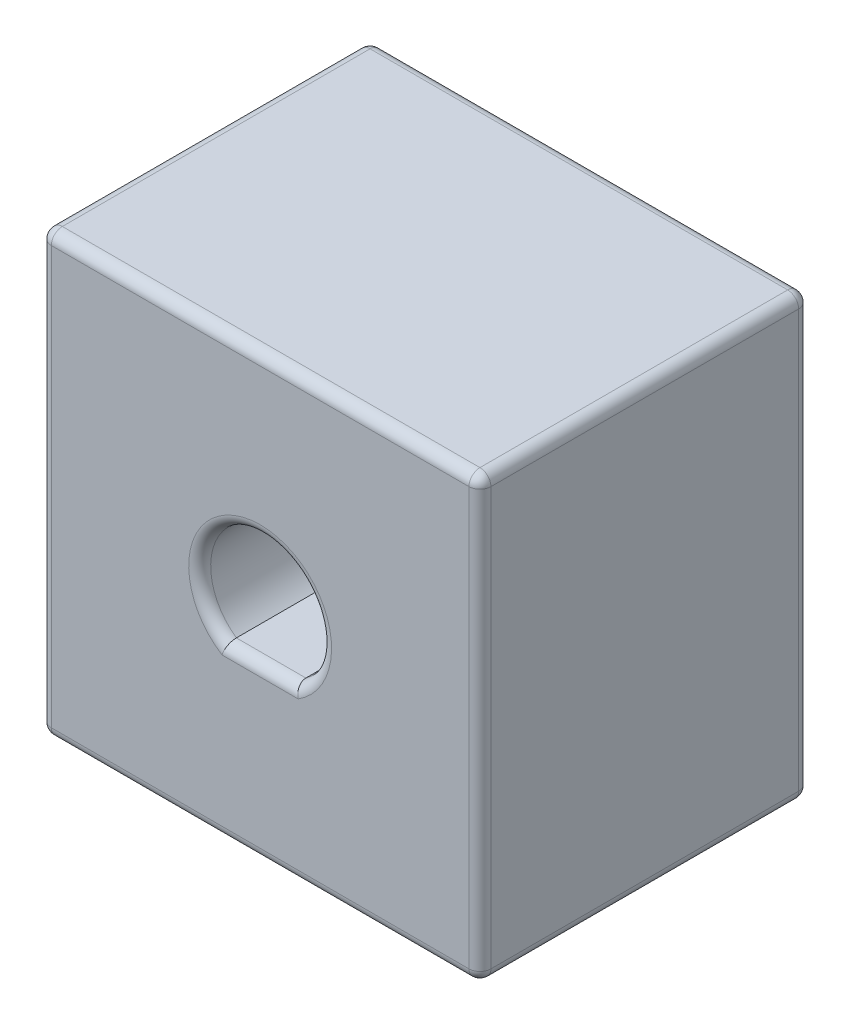
ISO-10303-21;
HEADER;
FILE_DESCRIPTION(('STEP AP214'),'2;1');
FILE_NAME('part.step','',(''),(''),'','','');
FILE_SCHEMA(('AUTOMOTIVE_DESIGN { 1 0 10303 214 1 1 1 1 }'));
ENDSEC;
DATA;
#1=APPLICATION_CONTEXT('core data for automotive mechanical design processes');
#2=APPLICATION_PROTOCOL_DEFINITION('international standard','automotive_design',2000,#1);
#3=PRODUCT_CONTEXT('',#1,'mechanical');
#4=PRODUCT('Part','Part','',(#3));
#5=PRODUCT_RELATED_PRODUCT_CATEGORY('part','',(#4));
#6=PRODUCT_DEFINITION_FORMATION('','',#4);
#7=PRODUCT_DEFINITION_CONTEXT('part definition',#1,'design');
#8=PRODUCT_DEFINITION('design','',#6,#7);
#9=PRODUCT_DEFINITION_SHAPE('','',#8);
#10=(LENGTH_UNIT() NAMED_UNIT(*) SI_UNIT(.MILLI.,.METRE.));
#11=(NAMED_UNIT(*) PLANE_ANGLE_UNIT() SI_UNIT($,.RADIAN.));
#12=(NAMED_UNIT(*) SI_UNIT($,.STERADIAN.) SOLID_ANGLE_UNIT());
#13=UNCERTAINTY_MEASURE_WITH_UNIT(LENGTH_MEASURE(1.E-05),#10,'distance_accuracy_value','');
#14=(GEOMETRIC_REPRESENTATION_CONTEXT(3) GLOBAL_UNCERTAINTY_ASSIGNED_CONTEXT((#13)) GLOBAL_UNIT_ASSIGNED_CONTEXT((#10,
#11,#12)) REPRESENTATION_CONTEXT('',''));
#15=CARTESIAN_POINT('',(0.,0.,0.));
#16=DIRECTION('',(0.,0.,1.));
#17=DIRECTION('',(1.,0.,0.));
#18=AXIS2_PLACEMENT_3D('',#15,#16,#17);
#19=CARTESIAN_POINT('',(0.,-10.,15.));
#20=DIRECTION('',(0.,1.,0.));
#21=DIRECTION('',(0.,0.,1.));
#22=AXIS2_PLACEMENT_3D('',#19,#20,#21);
#23=PLANE('',#22);
#24=DIRECTION('',(0.,0.,-1.));
#25=VECTOR('',#24,1.);
#26=CARTESIAN_POINT('',(9.5,-10.,15.));
#27=LINE('',#26,#25);
#28=CARTESIAN_POINT('',(9.5,-10.,0.5));
#29=VERTEX_POINT('',#28);
#30=CARTESIAN_POINT('',(9.5,-10.,14.5));
#31=VERTEX_POINT('',#30);
#32=EDGE_CURVE('E181',#29,#31,#27,.F.);
#33=ORIENTED_EDGE('',*,*,#32,.T.);
#34=DIRECTION('',(1.,0.,0.));
#35=VECTOR('',#34,1.);
#36=CARTESIAN_POINT('',(-10.,-10.,14.5));
#37=LINE('',#36,#35);
#38=CARTESIAN_POINT('',(-9.5,-10.,14.5));
#39=VERTEX_POINT('',#38);
#40=EDGE_CURVE('E185',#31,#39,#37,.F.);
#41=ORIENTED_EDGE('',*,*,#40,.T.);
#42=DIRECTION('',(0.,0.,-1.));
#43=VECTOR('',#42,1.);
#44=CARTESIAN_POINT('',(-9.5,-10.,0.));
#45=LINE('',#44,#43);
#46=CARTESIAN_POINT('',(-9.5,-10.,0.5));
#47=VERTEX_POINT('',#46);
#48=EDGE_CURVE('E157',#39,#47,#45,.T.);
#49=ORIENTED_EDGE('',*,*,#48,.T.);
#50=DIRECTION('',(1.,0.,0.));
#51=VECTOR('',#50,1.);
#52=CARTESIAN_POINT('',(0.,-10.,0.5));
#53=LINE('',#52,#51);
#54=EDGE_CURVE('E175',#47,#29,#53,.T.);
#55=ORIENTED_EDGE('',*,*,#54,.T.);
#56=EDGE_LOOP('',(#33,#41,#49,#55));
#57=FACE_BOUND('',#56,.T.);
#58=ADVANCED_FACE('F35',(#57),#23,.F.);
#59=CARTESIAN_POINT('',(10.,0.,15.));
#60=DIRECTION('',(-1.,0.,0.));
#61=DIRECTION('',(0.,0.,1.));
#62=AXIS2_PLACEMENT_3D('',#59,#60,#61);
#63=PLANE('',#62);
#64=DIRECTION('',(0.,1.,0.));
#65=VECTOR('',#64,1.);
#66=CARTESIAN_POINT('',(10.,-10.,14.5));
#67=LINE('',#66,#65);
#68=CARTESIAN_POINT('',(10.,9.5,14.5));
#69=VERTEX_POINT('',#68);
#70=CARTESIAN_POINT('',(10.,-9.5,14.5));
#71=VERTEX_POINT('',#70);
#72=EDGE_CURVE('E202',#69,#71,#67,.F.);
#73=ORIENTED_EDGE('',*,*,#72,.T.);
#74=DIRECTION('',(0.,0.,-1.));
#75=VECTOR('',#74,1.);
#76=CARTESIAN_POINT('',(10.,-9.5,15.));
#77=LINE('',#76,#75);
#78=CARTESIAN_POINT('',(10.,-9.5,0.5));
#79=VERTEX_POINT('',#78);
#80=EDGE_CURVE('E204',#71,#79,#77,.T.);
#81=ORIENTED_EDGE('',*,*,#80,.T.);
#82=DIRECTION('',(0.,1.,0.));
#83=VECTOR('',#82,1.);
#84=CARTESIAN_POINT('',(10.,0.,0.5));
#85=LINE('',#84,#83);
#86=CARTESIAN_POINT('',(10.,9.5,0.5));
#87=VERTEX_POINT('',#86);
#88=EDGE_CURVE('E200',#79,#87,#85,.T.);
#89=ORIENTED_EDGE('',*,*,#88,.T.);
#90=DIRECTION('',(0.,0.,-1.));
#91=VECTOR('',#90,1.);
#92=CARTESIAN_POINT('',(10.,9.5,15.));
#93=LINE('',#92,#91);
#94=EDGE_CURVE('E198',#87,#69,#93,.F.);
#95=ORIENTED_EDGE('',*,*,#94,.T.);
#96=EDGE_LOOP('',(#73,#81,#89,#95));
#97=FACE_BOUND('',#96,.T.);
#98=ADVANCED_FACE('F430',(#97),#63,.F.);
#99=CARTESIAN_POINT('',(0.,10.,15.));
#100=DIRECTION('',(0.,1.,0.));
#101=DIRECTION('',(0.,0.,1.));
#102=AXIS2_PLACEMENT_3D('',#99,#100,#101);
#103=PLANE('',#102);
#104=DIRECTION('',(1.,0.,0.));
#105=VECTOR('',#104,1.);
#106=CARTESIAN_POINT('',(0.,10.,14.5));
#107=LINE('',#106,#105);
#108=CARTESIAN_POINT('',(-9.5,10.,14.5));
#109=VERTEX_POINT('',#108);
#110=CARTESIAN_POINT('',(9.5,10.,14.5));
#111=VERTEX_POINT('',#110);
#112=EDGE_CURVE('E49',#109,#111,#107,.T.);
#113=ORIENTED_EDGE('',*,*,#112,.T.);
#114=DIRECTION('',(0.,0.,-1.));
#115=VECTOR('',#114,1.);
#116=CARTESIAN_POINT('',(9.5,10.,0.));
#117=LINE('',#116,#115);
#118=CARTESIAN_POINT('',(9.5,10.,0.5));
#119=VERTEX_POINT('',#118);
#120=EDGE_CURVE('E11',#111,#119,#117,.T.);
#121=ORIENTED_EDGE('',*,*,#120,.T.);
#122=DIRECTION('',(1.,0.,0.));
#123=VECTOR('',#122,1.);
#124=CARTESIAN_POINT('',(-10.,10.,0.5));
#125=LINE('',#124,#123);
#126=CARTESIAN_POINT('',(-9.5,10.,0.5));
#127=VERTEX_POINT('',#126);
#128=EDGE_CURVE('E245',#119,#127,#125,.F.);
#129=ORIENTED_EDGE('',*,*,#128,.T.);
#130=DIRECTION('',(0.,0.,-1.));
#131=VECTOR('',#130,1.);
#132=CARTESIAN_POINT('',(-9.5,10.,15.));
#133=LINE('',#132,#131);
#134=EDGE_CURVE('E60',#127,#109,#133,.F.);
#135=ORIENTED_EDGE('',*,*,#134,.T.);
#136=EDGE_LOOP('',(#113,#121,#129,#135));
#137=FACE_BOUND('',#136,.T.);
#138=ADVANCED_FACE('F435',(#137),#103,.T.);
#139=CARTESIAN_POINT('',(0.,0.,15.));
#140=DIRECTION('',(0.,0.,-1.));
#141=DIRECTION('',(-1.,0.,0.));
#142=AXIS2_PLACEMENT_3D('',#139,#140,#141);
#143=CYLINDRICAL_SURFACE('',#142,2.75);
#144=DIRECTION('',(0.,0.,-1.));
#145=VECTOR('',#144,1.);
#146=CARTESIAN_POINT('',(1.58113883008419,-2.25,15.));
#147=LINE('',#146,#145);
#148=CARTESIAN_POINT('',(1.58113883008419,-2.25,14.5));
#149=VERTEX_POINT('',#148);
#150=CARTESIAN_POINT('',(1.58113883008419,-2.25,0.5));
#151=VERTEX_POINT('',#150);
#152=EDGE_CURVE('E182',#149,#151,#147,.T.);
#153=ORIENTED_EDGE('',*,*,#152,.F.);
#154=CARTESIAN_POINT('',(0.,0.,14.5));
#155=DIRECTION('',(0.,0.,1.));
#156=DIRECTION('',(1.,0.,0.));
#157=AXIS2_PLACEMENT_3D('',#154,#155,#156);
#158=CIRCLE('',#157,2.75);
#159=CARTESIAN_POINT('',(-1.58113883008419,-2.25,14.5));
#160=VERTEX_POINT('',#159);
#161=EDGE_CURVE('E229',#149,#160,#158,.T.);
#162=ORIENTED_EDGE('',*,*,#161,.T.);
#163=DIRECTION('',(0.,0.,-1.));
#164=VECTOR('',#163,1.);
#165=CARTESIAN_POINT('',(-1.58113883008419,-2.25,15.));
#166=LINE('',#165,#164);
#167=CARTESIAN_POINT('',(-1.58113883008419,-2.25,0.5));
#168=VERTEX_POINT('',#167);
#169=EDGE_CURVE('E306',#160,#168,#166,.T.);
#170=ORIENTED_EDGE('',*,*,#169,.T.);
#171=CARTESIAN_POINT('',(0.,0.,0.5));
#172=DIRECTION('',(0.,0.,1.));
#173=DIRECTION('',(1.,0.,0.));
#174=AXIS2_PLACEMENT_3D('',#171,#172,#173);
#175=CIRCLE('',#174,2.75);
#176=EDGE_CURVE('E227',#168,#151,#175,.F.);
#177=ORIENTED_EDGE('',*,*,#176,.T.);
#178=EDGE_LOOP('',(#153,#162,#170,#177));
#179=FACE_BOUND('',#178,.T.);
#180=ADVANCED_FACE('F352',(#179),#143,.F.);
#181=CARTESIAN_POINT('',(0.,-2.25,15.));
#182=DIRECTION('',(0.,1.,0.));
#183=DIRECTION('',(-1.,0.,0.));
#184=AXIS2_PLACEMENT_3D('',#181,#182,#183);
#185=PLANE('',#184);
#186=ORIENTED_EDGE('',*,*,#169,.F.);
#187=DIRECTION('',(1.,0.,0.));
#188=VECTOR('',#187,1.);
#189=CARTESIAN_POINT('',(0.,-2.25,14.5));
#190=LINE('',#189,#188);
#191=EDGE_CURVE('E224',#160,#149,#190,.T.);
#192=ORIENTED_EDGE('',*,*,#191,.T.);
#193=ORIENTED_EDGE('',*,*,#152,.T.);
#194=DIRECTION('',(1.,0.,0.));
#195=VECTOR('',#194,1.);
#196=CARTESIAN_POINT('',(-1.58113883008419,-2.25,0.5));
#197=LINE('',#196,#195);
#198=EDGE_CURVE('E221',#151,#168,#197,.F.);
#199=ORIENTED_EDGE('',*,*,#198,.T.);
#200=EDGE_LOOP('',(#186,#192,#193,#199));
#201=FACE_BOUND('',#200,.T.);
#202=ADVANCED_FACE('F350',(#201),#185,.T.);
#203=CARTESIAN_POINT('',(-10.,0.,15.));
#204=DIRECTION('',(-1.,0.,0.));
#205=DIRECTION('',(0.,0.,1.));
#206=AXIS2_PLACEMENT_3D('',#203,#204,#205);
#207=PLANE('',#206);
#208=DIRECTION('',(0.,1.,0.));
#209=VECTOR('',#208,1.);
#210=CARTESIAN_POINT('',(-10.,-10.,0.5));
#211=LINE('',#210,#209);
#212=CARTESIAN_POINT('',(-10.,9.5,0.5));
#213=VERTEX_POINT('',#212);
#214=CARTESIAN_POINT('',(-10.,-9.5,0.5));
#215=VERTEX_POINT('',#214);
#216=EDGE_CURVE('E193',#213,#215,#211,.F.);
#217=ORIENTED_EDGE('',*,*,#216,.T.);
#218=DIRECTION('',(0.,0.,-1.));
#219=VECTOR('',#218,1.);
#220=CARTESIAN_POINT('',(-10.,-9.5,15.));
#221=LINE('',#220,#219);
#222=CARTESIAN_POINT('',(-10.,-9.5,14.5));
#223=VERTEX_POINT('',#222);
#224=EDGE_CURVE('E159',#215,#223,#221,.F.);
#225=ORIENTED_EDGE('',*,*,#224,.T.);
#226=DIRECTION('',(0.,1.,0.));
#227=VECTOR('',#226,1.);
#228=CARTESIAN_POINT('',(-10.,0.,14.5));
#229=LINE('',#228,#227);
#230=CARTESIAN_POINT('',(-10.,9.5,14.5));
#231=VERTEX_POINT('',#230);
#232=EDGE_CURVE('E195',#223,#231,#229,.T.);
#233=ORIENTED_EDGE('',*,*,#232,.T.);
#234=DIRECTION('',(0.,0.,-1.));
#235=VECTOR('',#234,1.);
#236=CARTESIAN_POINT('',(-10.,9.5,15.));
#237=LINE('',#236,#235);
#238=EDGE_CURVE('E188',#231,#213,#237,.T.);
#239=ORIENTED_EDGE('',*,*,#238,.T.);
#240=EDGE_LOOP('',(#217,#225,#233,#239));
#241=FACE_BOUND('',#240,.T.);
#242=ADVANCED_FACE('F366',(#241),#207,.T.);
#243=CARTESIAN_POINT('',(0.,0.,15.));
#244=DIRECTION('',(0.,0.,1.));
#245=DIRECTION('',(1.,0.,0.));
#246=AXIS2_PLACEMENT_3D('',#243,#244,#245);
#247=PLANE('',#246);
#248=CARTESIAN_POINT('',(0.,0.,15.));
#249=DIRECTION('',(0.,0.,1.));
#250=DIRECTION('',(1.,0.,0.));
#251=AXIS2_PLACEMENT_3D('',#248,#249,#250);
#252=CIRCLE('',#251,3.25);
#253=CARTESIAN_POINT('',(-1.73205080756888,-2.75,15.));
#254=VERTEX_POINT('',#253);
#255=CARTESIAN_POINT('',(1.73205080756888,-2.75,15.));
#256=VERTEX_POINT('',#255);
#257=EDGE_CURVE('E216',#254,#256,#252,.F.);
#258=ORIENTED_EDGE('',*,*,#257,.T.);
#259=DIRECTION('',(1.,0.,0.));
#260=VECTOR('',#259,1.);
#261=CARTESIAN_POINT('',(0.,-2.75,15.));
#262=LINE('',#261,#260);
#263=EDGE_CURVE('E218',#256,#254,#262,.F.);
#264=ORIENTED_EDGE('',*,*,#263,.T.);
#265=EDGE_LOOP('',(#258,#264));
#266=FACE_BOUND('',#265,.T.);
#267=DIRECTION('',(0.,1.,0.));
#268=VECTOR('',#267,1.);
#269=CARTESIAN_POINT('',(-9.5,0.,15.));
#270=LINE('',#269,#268);
#271=CARTESIAN_POINT('',(-9.5,9.5,15.));
#272=VERTEX_POINT('',#271);
#273=CARTESIAN_POINT('',(-9.5,-9.5,15.));
#274=VERTEX_POINT('',#273);
#275=EDGE_CURVE('E211',#272,#274,#270,.F.);
#276=ORIENTED_EDGE('',*,*,#275,.T.);
#277=DIRECTION('',(1.,0.,0.));
#278=VECTOR('',#277,1.);
#279=CARTESIAN_POINT('',(10.,-9.5,15.));
#280=LINE('',#279,#278);
#281=CARTESIAN_POINT('',(9.5,-9.5,15.));
#282=VERTEX_POINT('',#281);
#283=EDGE_CURVE('E214',#274,#282,#280,.T.);
#284=ORIENTED_EDGE('',*,*,#283,.T.);
#285=DIRECTION('',(0.,1.,0.));
#286=VECTOR('',#285,1.);
#287=CARTESIAN_POINT('',(9.5,10.,15.));
#288=LINE('',#287,#286);
#289=CARTESIAN_POINT('',(9.5,9.5,15.));
#290=VERTEX_POINT('',#289);
#291=EDGE_CURVE('E209',#282,#290,#288,.T.);
#292=ORIENTED_EDGE('',*,*,#291,.T.);
#293=DIRECTION('',(1.,0.,0.));
#294=VECTOR('',#293,1.);
#295=CARTESIAN_POINT('',(0.,9.5,15.));
#296=LINE('',#295,#294);
#297=EDGE_CURVE('E207',#290,#272,#296,.F.);
#298=ORIENTED_EDGE('',*,*,#297,.T.);
#299=EDGE_LOOP('',(#276,#284,#292,#298));
#300=FACE_BOUND('',#299,.T.);
#301=ADVANCED_FACE('F362',(#266,#300),#247,.T.);
#302=CARTESIAN_POINT('',(0.,0.,0.));
#303=DIRECTION('',(0.,0.,1.));
#304=DIRECTION('',(1.,0.,0.));
#305=AXIS2_PLACEMENT_3D('',#302,#303,#304);
#306=PLANE('',#305);
#307=CARTESIAN_POINT('',(0.,0.,0.));
#308=DIRECTION('',(0.,0.,1.));
#309=DIRECTION('',(1.,0.,0.));
#310=AXIS2_PLACEMENT_3D('',#307,#308,#309);
#311=CIRCLE('',#310,3.25);
#312=CARTESIAN_POINT('',(1.73205080756888,-2.75,0.));
#313=VERTEX_POINT('',#312);
#314=CARTESIAN_POINT('',(-1.73205080756888,-2.75,0.));
#315=VERTEX_POINT('',#314);
#316=EDGE_CURVE('E240',#313,#315,#311,.T.);
#317=ORIENTED_EDGE('',*,*,#316,.T.);
#318=DIRECTION('',(1.,0.,0.));
#319=VECTOR('',#318,1.);
#320=CARTESIAN_POINT('',(1.58113883008419,-2.75,0.));
#321=LINE('',#320,#319);
#322=EDGE_CURVE('E242',#315,#313,#321,.T.);
#323=ORIENTED_EDGE('',*,*,#322,.T.);
#324=EDGE_LOOP('',(#317,#323));
#325=FACE_BOUND('',#324,.T.);
#326=DIRECTION('',(0.,1.,0.));
#327=VECTOR('',#326,1.);
#328=CARTESIAN_POINT('',(9.5,0.,0.));
#329=LINE('',#328,#327);
#330=CARTESIAN_POINT('',(9.5,9.5,0.));
#331=VERTEX_POINT('',#330);
#332=CARTESIAN_POINT('',(9.5,-9.5,0.));
#333=VERTEX_POINT('',#332);
#334=EDGE_CURVE('E235',#331,#333,#329,.F.);
#335=ORIENTED_EDGE('',*,*,#334,.T.);
#336=DIRECTION('',(1.,0.,0.));
#337=VECTOR('',#336,1.);
#338=CARTESIAN_POINT('',(0.,-9.5,0.));
#339=LINE('',#338,#337);
#340=CARTESIAN_POINT('',(-9.5,-9.5,0.));
#341=VERTEX_POINT('',#340);
#342=EDGE_CURVE('E238',#333,#341,#339,.F.);
#343=ORIENTED_EDGE('',*,*,#342,.T.);
#344=DIRECTION('',(0.,1.,0.));
#345=VECTOR('',#344,1.);
#346=CARTESIAN_POINT('',(-9.5,10.,0.));
#347=LINE('',#346,#345);
#348=CARTESIAN_POINT('',(-9.5,9.5,0.));
#349=VERTEX_POINT('',#348);
#350=EDGE_CURVE('E233',#341,#349,#347,.T.);
#351=ORIENTED_EDGE('',*,*,#350,.T.);
#352=DIRECTION('',(1.,0.,0.));
#353=VECTOR('',#352,1.);
#354=CARTESIAN_POINT('',(10.,9.5,0.));
#355=LINE('',#354,#353);
#356=EDGE_CURVE('E231',#349,#331,#355,.T.);
#357=ORIENTED_EDGE('',*,*,#356,.T.);
#358=EDGE_LOOP('',(#335,#343,#351,#357));
#359=FACE_BOUND('',#358,.T.);
#360=ADVANCED_FACE('F365',(#325,#359),#306,.F.);
#361=CARTESIAN_POINT('',(9.5,9.5,15.));
#362=DIRECTION('',(0.,0.,1.));
#363=DIRECTION('',(1.,0.,0.));
#364=AXIS2_PLACEMENT_3D('',#361,#362,#363);
#365=CYLINDRICAL_SURFACE('',#364,0.5);
#366=CARTESIAN_POINT('',(9.5,9.5,14.5));
#367=DIRECTION('',(0.,0.,1.));
#368=DIRECTION('',(1.,0.,0.));
#369=AXIS2_PLACEMENT_3D('',#366,#367,#368);
#370=CIRCLE('',#369,0.5);
#371=EDGE_CURVE('E303',#69,#111,#370,.T.);
#372=ORIENTED_EDGE('',*,*,#371,.F.);
#373=ORIENTED_EDGE('',*,*,#94,.F.);
#374=CARTESIAN_POINT('',(9.5,9.5,0.5));
#375=DIRECTION('',(0.,0.,-1.));
#376=DIRECTION('',(-1.,0.,0.));
#377=AXIS2_PLACEMENT_3D('',#374,#375,#376);
#378=CIRCLE('',#377,0.5);
#379=EDGE_CURVE('E300',#119,#87,#378,.T.);
#380=ORIENTED_EDGE('',*,*,#379,.F.);
#381=ORIENTED_EDGE('',*,*,#120,.F.);
#382=EDGE_LOOP('',(#372,#373,#380,#381));
#383=FACE_BOUND('',#382,.T.);
#384=ADVANCED_FACE('F608',(#383),#365,.T.);
#385=CARTESIAN_POINT('',(9.5,9.5,14.5));
#386=DIRECTION('',(0.,0.,1.));
#387=DIRECTION('',(1.,0.,0.));
#388=AXIS2_PLACEMENT_3D('',#385,#386,#387);
#389=SPHERICAL_SURFACE('',#388,0.5);
#390=CARTESIAN_POINT('',(9.5,9.5,14.5));
#391=DIRECTION('',(0.,1.,0.));
#392=DIRECTION('',(0.,0.,1.));
#393=AXIS2_PLACEMENT_3D('',#390,#391,#392);
#394=CIRCLE('',#393,0.5);
#395=EDGE_CURVE('E294',#69,#290,#394,.F.);
#396=ORIENTED_EDGE('',*,*,#395,.F.);
#397=ORIENTED_EDGE('',*,*,#371,.T.);
#398=CARTESIAN_POINT('',(9.5,9.5,14.5));
#399=DIRECTION('',(1.,0.,0.));
#400=DIRECTION('',(0.,0.,-1.));
#401=AXIS2_PLACEMENT_3D('',#398,#399,#400);
#402=CIRCLE('',#401,0.5);
#403=EDGE_CURVE('E297',#290,#111,#402,.F.);
#404=ORIENTED_EDGE('',*,*,#403,.F.);
#405=EDGE_LOOP('',(#396,#397,#404));
#406=FACE_BOUND('',#405,.T.);
#407=ADVANCED_FACE('F393',(#406),#389,.T.);
#408=CARTESIAN_POINT('',(9.5,9.5,0.5));
#409=DIRECTION('',(0.,0.,1.));
#410=DIRECTION('',(1.,0.,0.));
#411=AXIS2_PLACEMENT_3D('',#408,#409,#410);
#412=SPHERICAL_SURFACE('',#411,0.5);
#413=CARTESIAN_POINT('',(9.5,9.5,0.5));
#414=DIRECTION('',(1.,0.,0.));
#415=DIRECTION('',(0.,0.,-1.));
#416=AXIS2_PLACEMENT_3D('',#413,#414,#415);
#417=CIRCLE('',#416,0.5);
#418=EDGE_CURVE('E288',#119,#331,#417,.F.);
#419=ORIENTED_EDGE('',*,*,#418,.F.);
#420=ORIENTED_EDGE('',*,*,#379,.T.);
#421=CARTESIAN_POINT('',(9.5,9.5,0.5));
#422=DIRECTION('',(0.,1.,0.));
#423=DIRECTION('',(0.,0.,1.));
#424=AXIS2_PLACEMENT_3D('',#421,#422,#423);
#425=CIRCLE('',#424,0.5);
#426=EDGE_CURVE('E291',#331,#87,#425,.F.);
#427=ORIENTED_EDGE('',*,*,#426,.F.);
#428=EDGE_LOOP('',(#419,#420,#427));
#429=FACE_BOUND('',#428,.T.);
#430=ADVANCED_FACE('F592',(#429),#412,.T.);
#431=CARTESIAN_POINT('',(0.,9.5,14.5));
#432=DIRECTION('',(1.,0.,0.));
#433=DIRECTION('',(0.,0.,-1.));
#434=AXIS2_PLACEMENT_3D('',#431,#432,#433);
#435=CYLINDRICAL_SURFACE('',#434,0.5);
#436=ORIENTED_EDGE('',*,*,#403,.T.);
#437=ORIENTED_EDGE('',*,*,#112,.F.);
#438=CARTESIAN_POINT('',(-9.5,9.5,14.5));
#439=DIRECTION('',(-1.,0.,0.));
#440=DIRECTION('',(0.,0.,1.));
#441=AXIS2_PLACEMENT_3D('',#438,#439,#440);
#442=CIRCLE('',#441,0.5);
#443=EDGE_CURVE('E282',#272,#109,#442,.T.);
#444=ORIENTED_EDGE('',*,*,#443,.F.);
#445=ORIENTED_EDGE('',*,*,#297,.F.);
#446=EDGE_LOOP('',(#436,#437,#444,#445));
#447=FACE_BOUND('',#446,.T.);
#448=ADVANCED_FACE('F396',(#447),#435,.T.);
#449=CARTESIAN_POINT('',(9.5,0.,14.5));
#450=DIRECTION('',(0.,-1.,0.));
#451=DIRECTION('',(0.,0.,-1.));
#452=AXIS2_PLACEMENT_3D('',#449,#450,#451);
#453=CYLINDRICAL_SURFACE('',#452,0.5);
#454=ORIENTED_EDGE('',*,*,#395,.T.);
#455=ORIENTED_EDGE('',*,*,#291,.F.);
#456=CARTESIAN_POINT('',(9.5,-9.5,14.5));
#457=DIRECTION('',(0.,-1.,0.));
#458=DIRECTION('',(0.,0.,-1.));
#459=AXIS2_PLACEMENT_3D('',#456,#457,#458);
#460=CIRCLE('',#459,0.5);
#461=EDGE_CURVE('E279',#71,#282,#460,.T.);
#462=ORIENTED_EDGE('',*,*,#461,.F.);
#463=ORIENTED_EDGE('',*,*,#72,.F.);
#464=EDGE_LOOP('',(#454,#455,#462,#463));
#465=FACE_BOUND('',#464,.T.);
#466=ADVANCED_FACE('F389',(#465),#453,.T.);
#467=CARTESIAN_POINT('',(9.5,-9.5,15.));
#468=DIRECTION('',(0.,0.,-1.));
#469=DIRECTION('',(-1.,0.,0.));
#470=AXIS2_PLACEMENT_3D('',#467,#468,#469);
#471=CYLINDRICAL_SURFACE('',#470,0.5);
#472=CARTESIAN_POINT('',(9.5,-9.5,0.5));
#473=DIRECTION('',(0.,0.,-1.));
#474=DIRECTION('',(-1.,0.,0.));
#475=AXIS2_PLACEMENT_3D('',#472,#473,#474);
#476=CIRCLE('',#475,0.5);
#477=EDGE_CURVE('E273',#79,#29,#476,.T.);
#478=ORIENTED_EDGE('',*,*,#477,.F.);
#479=ORIENTED_EDGE('',*,*,#80,.F.);
#480=CARTESIAN_POINT('',(9.5,-9.5,14.5));
#481=DIRECTION('',(0.,0.,1.));
#482=DIRECTION('',(1.,0.,0.));
#483=AXIS2_PLACEMENT_3D('',#480,#481,#482);
#484=CIRCLE('',#483,0.5);
#485=EDGE_CURVE('E276',#31,#71,#484,.T.);
#486=ORIENTED_EDGE('',*,*,#485,.F.);
#487=ORIENTED_EDGE('',*,*,#32,.F.);
#488=EDGE_LOOP('',(#478,#479,#486,#487));
#489=FACE_BOUND('',#488,.T.);
#490=ADVANCED_FACE('F568',(#489),#471,.T.);
#491=CARTESIAN_POINT('',(9.5,0.,0.5));
#492=DIRECTION('',(0.,1.,0.));
#493=DIRECTION('',(0.,0.,1.));
#494=AXIS2_PLACEMENT_3D('',#491,#492,#493);
#495=CYLINDRICAL_SURFACE('',#494,0.5);
#496=ORIENTED_EDGE('',*,*,#426,.T.);
#497=ORIENTED_EDGE('',*,*,#88,.F.);
#498=CARTESIAN_POINT('',(9.5,-9.5,0.5));
#499=DIRECTION('',(0.,-1.,0.));
#500=DIRECTION('',(0.,0.,-1.));
#501=AXIS2_PLACEMENT_3D('',#498,#499,#500);
#502=CIRCLE('',#501,0.5);
#503=EDGE_CURVE('E271',#333,#79,#502,.T.);
#504=ORIENTED_EDGE('',*,*,#503,.F.);
#505=ORIENTED_EDGE('',*,*,#334,.F.);
#506=EDGE_LOOP('',(#496,#497,#504,#505));
#507=FACE_BOUND('',#506,.T.);
#508=ADVANCED_FACE('F560',(#507),#495,.T.);
#509=CARTESIAN_POINT('',(0.,9.5,0.5));
#510=DIRECTION('',(-1.,0.,0.));
#511=DIRECTION('',(0.,0.,1.));
#512=AXIS2_PLACEMENT_3D('',#509,#510,#511);
#513=CYLINDRICAL_SURFACE('',#512,0.5);
#514=ORIENTED_EDGE('',*,*,#418,.T.);
#515=ORIENTED_EDGE('',*,*,#356,.F.);
#516=CARTESIAN_POINT('',(-9.5,9.5,0.5));
#517=DIRECTION('',(-1.,0.,0.));
#518=DIRECTION('',(0.,0.,1.));
#519=AXIS2_PLACEMENT_3D('',#516,#517,#518);
#520=CIRCLE('',#519,0.5);
#521=EDGE_CURVE('E268',#127,#349,#520,.T.);
#522=ORIENTED_EDGE('',*,*,#521,.F.);
#523=ORIENTED_EDGE('',*,*,#128,.F.);
#524=EDGE_LOOP('',(#514,#515,#522,#523));
#525=FACE_BOUND('',#524,.T.);
#526=ADVANCED_FACE('F414',(#525),#513,.T.);
#527=CARTESIAN_POINT('',(-9.5,9.5,15.));
#528=DIRECTION('',(0.,0.,-1.));
#529=DIRECTION('',(-1.,0.,0.));
#530=AXIS2_PLACEMENT_3D('',#527,#528,#529);
#531=CYLINDRICAL_SURFACE('',#530,0.5);
#532=CARTESIAN_POINT('',(-9.5,9.5,14.5));
#533=DIRECTION('',(0.,0.,1.));
#534=DIRECTION('',(1.,0.,0.));
#535=AXIS2_PLACEMENT_3D('',#532,#533,#534);
#536=CIRCLE('',#535,0.5);
#537=EDGE_CURVE('E285',#109,#231,#536,.T.);
#538=ORIENTED_EDGE('',*,*,#537,.F.);
#539=ORIENTED_EDGE('',*,*,#134,.F.);
#540=CARTESIAN_POINT('',(-9.5,9.5,0.5));
#541=DIRECTION('',(0.,0.,-1.));
#542=DIRECTION('',(-1.,0.,0.));
#543=AXIS2_PLACEMENT_3D('',#540,#541,#542);
#544=CIRCLE('',#543,0.5);
#545=EDGE_CURVE('E265',#213,#127,#544,.T.);
#546=ORIENTED_EDGE('',*,*,#545,.F.);
#547=ORIENTED_EDGE('',*,*,#238,.F.);
#548=EDGE_LOOP('',(#538,#539,#546,#547));
#549=FACE_BOUND('',#548,.T.);
#550=ADVANCED_FACE('F402',(#549),#531,.T.);
#551=CARTESIAN_POINT('',(-9.5,9.5,14.5));
#552=DIRECTION('',(0.,0.,1.));
#553=DIRECTION('',(1.,0.,0.));
#554=AXIS2_PLACEMENT_3D('',#551,#552,#553);
#555=SPHERICAL_SURFACE('',#554,0.5);
#556=ORIENTED_EDGE('',*,*,#443,.T.);
#557=ORIENTED_EDGE('',*,*,#537,.T.);
#558=CARTESIAN_POINT('',(-9.5,9.5,14.5));
#559=DIRECTION('',(0.,1.,0.));
#560=DIRECTION('',(0.,0.,1.));
#561=AXIS2_PLACEMENT_3D('',#558,#559,#560);
#562=CIRCLE('',#561,0.5);
#563=EDGE_CURVE('E262',#272,#231,#562,.F.);
#564=ORIENTED_EDGE('',*,*,#563,.F.);
#565=EDGE_LOOP('',(#556,#557,#564));
#566=FACE_BOUND('',#565,.T.);
#567=ADVANCED_FACE('F399',(#566),#555,.T.);
#568=CARTESIAN_POINT('',(9.5,-9.5,14.5));
#569=DIRECTION('',(0.,0.,1.));
#570=DIRECTION('',(1.,0.,0.));
#571=AXIS2_PLACEMENT_3D('',#568,#569,#570);
#572=SPHERICAL_SURFACE('',#571,0.5);
#573=ORIENTED_EDGE('',*,*,#485,.T.);
#574=ORIENTED_EDGE('',*,*,#461,.T.);
#575=CARTESIAN_POINT('',(9.5,-9.5,14.5));
#576=DIRECTION('',(1.,0.,0.));
#577=DIRECTION('',(0.,0.,-1.));
#578=AXIS2_PLACEMENT_3D('',#575,#576,#577);
#579=CIRCLE('',#578,0.5);
#580=EDGE_CURVE('E259',#31,#282,#579,.F.);
#581=ORIENTED_EDGE('',*,*,#580,.F.);
#582=EDGE_LOOP('',(#573,#574,#581));
#583=FACE_BOUND('',#582,.T.);
#584=ADVANCED_FACE('F384',(#583),#572,.T.);
#585=CARTESIAN_POINT('',(9.5,-9.5,0.5));
#586=DIRECTION('',(0.,0.,1.));
#587=DIRECTION('',(1.,0.,0.));
#588=AXIS2_PLACEMENT_3D('',#585,#586,#587);
#589=SPHERICAL_SURFACE('',#588,0.5);
#590=ORIENTED_EDGE('',*,*,#503,.T.);
#591=ORIENTED_EDGE('',*,*,#477,.T.);
#592=CARTESIAN_POINT('',(9.5,-9.5,0.5));
#593=DIRECTION('',(1.,0.,0.));
#594=DIRECTION('',(0.,0.,-1.));
#595=AXIS2_PLACEMENT_3D('',#592,#593,#594);
#596=CIRCLE('',#595,0.5);
#597=EDGE_CURVE('E178',#333,#29,#596,.F.);
#598=ORIENTED_EDGE('',*,*,#597,.F.);
#599=EDGE_LOOP('',(#590,#591,#598));
#600=FACE_BOUND('',#599,.T.);
#601=ADVANCED_FACE('F420',(#600),#589,.T.);
#602=CARTESIAN_POINT('',(-9.5,9.5,0.5));
#603=DIRECTION('',(0.,0.,1.));
#604=DIRECTION('',(1.,0.,0.));
#605=AXIS2_PLACEMENT_3D('',#602,#603,#604);
#606=SPHERICAL_SURFACE('',#605,0.5);
#607=ORIENTED_EDGE('',*,*,#545,.T.);
#608=ORIENTED_EDGE('',*,*,#521,.T.);
#609=CARTESIAN_POINT('',(-9.5,9.5,0.5));
#610=DIRECTION('',(0.,1.,0.));
#611=DIRECTION('',(0.,0.,1.));
#612=AXIS2_PLACEMENT_3D('',#609,#610,#611);
#613=CIRCLE('',#612,0.5);
#614=EDGE_CURVE('E255',#213,#349,#613,.F.);
#615=ORIENTED_EDGE('',*,*,#614,.F.);
#616=EDGE_LOOP('',(#607,#608,#615));
#617=FACE_BOUND('',#616,.T.);
#618=ADVANCED_FACE('F418',(#617),#606,.T.);
#619=CARTESIAN_POINT('',(-9.5,0.,14.5));
#620=DIRECTION('',(0.,1.,0.));
#621=DIRECTION('',(0.,0.,1.));
#622=AXIS2_PLACEMENT_3D('',#619,#620,#621);
#623=CYLINDRICAL_SURFACE('',#622,0.5);
#624=ORIENTED_EDGE('',*,*,#563,.T.);
#625=ORIENTED_EDGE('',*,*,#232,.F.);
#626=CARTESIAN_POINT('',(-9.5,-9.5,14.5));
#627=DIRECTION('',(0.,-1.,0.));
#628=DIRECTION('',(0.,0.,-1.));
#629=AXIS2_PLACEMENT_3D('',#626,#627,#628);
#630=CIRCLE('',#629,0.5);
#631=EDGE_CURVE('E252',#274,#223,#630,.T.);
#632=ORIENTED_EDGE('',*,*,#631,.F.);
#633=ORIENTED_EDGE('',*,*,#275,.F.);
#634=EDGE_LOOP('',(#624,#625,#632,#633));
#635=FACE_BOUND('',#634,.T.);
#636=ADVANCED_FACE('F375',(#635),#623,.T.);
#637=CARTESIAN_POINT('',(0.,-9.5,14.5));
#638=DIRECTION('',(-1.,0.,0.));
#639=DIRECTION('',(0.,0.,1.));
#640=AXIS2_PLACEMENT_3D('',#637,#638,#639);
#641=CYLINDRICAL_SURFACE('',#640,0.5);
#642=ORIENTED_EDGE('',*,*,#580,.T.);
#643=ORIENTED_EDGE('',*,*,#283,.F.);
#644=CARTESIAN_POINT('',(-9.5,-9.5,14.5));
#645=DIRECTION('',(-1.,0.,0.));
#646=DIRECTION('',(0.,0.,1.));
#647=AXIS2_PLACEMENT_3D('',#644,#645,#646);
#648=CIRCLE('',#647,0.5);
#649=EDGE_CURVE('E172',#39,#274,#648,.T.);
#650=ORIENTED_EDGE('',*,*,#649,.F.);
#651=ORIENTED_EDGE('',*,*,#40,.F.);
#652=EDGE_LOOP('',(#642,#643,#650,#651));
#653=FACE_BOUND('',#652,.T.);
#654=ADVANCED_FACE('F381',(#653),#641,.T.);
#655=CARTESIAN_POINT('',(0.,-9.5,0.5));
#656=DIRECTION('',(1.,0.,0.));
#657=DIRECTION('',(0.,0.,-1.));
#658=AXIS2_PLACEMENT_3D('',#655,#656,#657);
#659=CYLINDRICAL_SURFACE('',#658,0.5);
#660=ORIENTED_EDGE('',*,*,#597,.T.);
#661=ORIENTED_EDGE('',*,*,#54,.F.);
#662=CARTESIAN_POINT('',(-9.5,-9.5,0.5));
#663=DIRECTION('',(-1.,0.,0.));
#664=DIRECTION('',(0.,0.,1.));
#665=AXIS2_PLACEMENT_3D('',#662,#663,#664);
#666=CIRCLE('',#665,0.5);
#667=EDGE_CURVE('E166',#341,#47,#666,.T.);
#668=ORIENTED_EDGE('',*,*,#667,.F.);
#669=ORIENTED_EDGE('',*,*,#342,.F.);
#670=EDGE_LOOP('',(#660,#661,#668,#669));
#671=FACE_BOUND('',#670,.T.);
#672=ADVANCED_FACE('F176',(#671),#659,.T.);
#673=CARTESIAN_POINT('',(-9.5,0.,0.5));
#674=DIRECTION('',(0.,-1.,0.));
#675=DIRECTION('',(0.,0.,-1.));
#676=AXIS2_PLACEMENT_3D('',#673,#674,#675);
#677=CYLINDRICAL_SURFACE('',#676,0.5);
#678=ORIENTED_EDGE('',*,*,#614,.T.);
#679=ORIENTED_EDGE('',*,*,#350,.F.);
#680=CARTESIAN_POINT('',(-9.5,-9.5,0.5));
#681=DIRECTION('',(0.,-1.,0.));
#682=DIRECTION('',(0.,0.,-1.));
#683=AXIS2_PLACEMENT_3D('',#680,#681,#682);
#684=CIRCLE('',#683,0.5);
#685=EDGE_CURVE('E170',#215,#341,#684,.T.);
#686=ORIENTED_EDGE('',*,*,#685,.F.);
#687=ORIENTED_EDGE('',*,*,#216,.F.);
#688=EDGE_LOOP('',(#678,#679,#686,#687));
#689=FACE_BOUND('',#688,.T.);
#690=ADVANCED_FACE('F410',(#689),#677,.T.);
#691=CARTESIAN_POINT('',(-9.5,-9.5,14.5));
#692=DIRECTION('',(0.,0.,1.));
#693=DIRECTION('',(1.,0.,0.));
#694=AXIS2_PLACEMENT_3D('',#691,#692,#693);
#695=SPHERICAL_SURFACE('',#694,0.5);
#696=ORIENTED_EDGE('',*,*,#649,.T.);
#697=ORIENTED_EDGE('',*,*,#631,.T.);
#698=CARTESIAN_POINT('',(-9.5,-9.5,14.5));
#699=DIRECTION('',(0.,0.,1.));
#700=DIRECTION('',(1.,0.,0.));
#701=AXIS2_PLACEMENT_3D('',#698,#699,#700);
#702=CIRCLE('',#701,0.5);
#703=EDGE_CURVE('E162',#39,#223,#702,.F.);
#704=ORIENTED_EDGE('',*,*,#703,.F.);
#705=EDGE_LOOP('',(#696,#697,#704));
#706=FACE_BOUND('',#705,.T.);
#707=ADVANCED_FACE('F448',(#706),#695,.T.);
#708=CARTESIAN_POINT('',(-9.5,-9.5,0.5));
#709=DIRECTION('',(0.,0.,1.));
#710=DIRECTION('',(1.,0.,0.));
#711=AXIS2_PLACEMENT_3D('',#708,#709,#710);
#712=SPHERICAL_SURFACE('',#711,0.5);
#713=ORIENTED_EDGE('',*,*,#685,.T.);
#714=ORIENTED_EDGE('',*,*,#667,.T.);
#715=CARTESIAN_POINT('',(-9.5,-9.5,0.5));
#716=DIRECTION('',(0.,0.,-1.));
#717=DIRECTION('',(-1.,0.,0.));
#718=AXIS2_PLACEMENT_3D('',#715,#716,#717);
#719=CIRCLE('',#718,0.5);
#720=EDGE_CURVE('E153',#215,#47,#719,.F.);
#721=ORIENTED_EDGE('',*,*,#720,.F.);
#722=EDGE_LOOP('',(#713,#714,#721));
#723=FACE_BOUND('',#722,.T.);
#724=ADVANCED_FACE('F168',(#723),#712,.T.);
#725=CARTESIAN_POINT('',(-9.5,-9.5,15.));
#726=DIRECTION('',(0.,0.,1.));
#727=DIRECTION('',(1.,0.,0.));
#728=AXIS2_PLACEMENT_3D('',#725,#726,#727);
#729=CYLINDRICAL_SURFACE('',#728,0.5);
#730=ORIENTED_EDGE('',*,*,#703,.T.);
#731=ORIENTED_EDGE('',*,*,#224,.F.);
#732=ORIENTED_EDGE('',*,*,#720,.T.);
#733=ORIENTED_EDGE('',*,*,#48,.F.);
#734=EDGE_LOOP('',(#730,#731,#732,#733));
#735=FACE_BOUND('',#734,.T.);
#736=ADVANCED_FACE('F155',(#735),#729,.T.);
#737=CARTESIAN_POINT('',(0.,0.,14.5));
#738=DIRECTION('',(0.,0.,1.));
#739=DIRECTION('',(1.,0.,0.));
#740=AXIS2_PLACEMENT_3D('',#737,#738,#739);
#741=TOROIDAL_SURFACE('',#740,3.25,0.5);
#742=CARTESIAN_POINT('',(1.58113883008419,-2.25,14.5));
#743=CARTESIAN_POINT('',(1.58112826445465,-2.24997224644084,14.5272105081084));
#744=CARTESIAN_POINT('',(1.5818406476876,-2.25221936477727,14.5544055433157));
#745=CARTESIAN_POINT('',(1.58463006756517,-2.26104902933996,14.607954467161));
#746=CARTESIAN_POINT('',(1.58670425455965,-2.26762252245637,14.6343099920323));
#747=CARTESIAN_POINT('',(1.5921366025268,-2.28489207487573,14.6854890255577));
#748=CARTESIAN_POINT('',(1.59549474007768,-2.29558805897634,14.7103125621488));
#749=CARTESIAN_POINT('',(1.6033553449771,-2.3207328736812,14.7577807040807));
#750=CARTESIAN_POINT('',(1.60785800946613,-2.33518235082004,14.7804249331166));
#751=CARTESIAN_POINT('',(1.61794445384771,-2.3677184123328,14.8234236582522));
#752=CARTESIAN_POINT('',(1.62354875674949,-2.38587434223003,14.8437207895188));
#753=CARTESIAN_POINT('',(1.63558034843886,-2.4250869199222,14.881003722254));
#754=CARTESIAN_POINT('',(1.6420079317097,-2.44614460586607,14.89798833334));
#755=CARTESIAN_POINT('',(1.65577575300983,-2.49154396895214,14.9289380488073));
#756=CARTESIAN_POINT('',(1.66314352948645,-2.5159886556048,14.9427396583941));
#757=CARTESIAN_POINT('',(1.67832581239611,-2.56672002574443,14.9660331160715));
#758=CARTESIAN_POINT('',(1.68614022818377,-2.593006335717,14.9755258351787));
#759=CARTESIAN_POINT('',(1.70004955167421,-2.64013246034714,14.9882328062966));
#760=CARTESIAN_POINT('',(1.70609772221939,-2.66073250866121,14.9924146735192));
#761=CARTESIAN_POINT('',(1.71822460450865,-2.70225918976552,14.9981552278359));
#762=CARTESIAN_POINT('',(1.7243032399777,-2.72318515492754,14.9997187077741));
#763=CARTESIAN_POINT('',(1.7309178836376,-2.74607639226558,14.9999884805503));
#764=CARTESIAN_POINT('',(1.73148450253794,-2.74803825441223,15.0000000305598));
#765=CARTESIAN_POINT('',(1.73205080756888,-2.75,15.));
#766=B_SPLINE_CURVE_WITH_KNOTS('',3,(#742,#743,#744,#745,#746,#747,#748,#749,#750,#751,#752,
#753,#754,#755,#756,#757,#758,#759,#760,#761,#762,#763,#764,#765),.UNSPECIFIED.,.F.,.F.,(4,2,2,
2,2,2,2,2,2,2,2,4),(0.,0.081505876429181,0.16284173855684,0.244176117028785,0.32552451454849,
0.408563488235141,0.491632247928624,0.578314630231846,0.664979482397793,0.730454400712581,
0.79580933851167,0.801935427642705),.UNSPECIFIED.);
#767=EDGE_CURVE('E307',#256,#149,#766,.F.);
#768=ORIENTED_EDGE('',*,*,#767,.F.);
#769=ORIENTED_EDGE('',*,*,#257,.F.);
#770=CARTESIAN_POINT('',(-1.58113883008419,-2.25,14.5));
#771=CARTESIAN_POINT('',(-1.58112826445465,-2.24997224644084,14.5272105081084));
#772=CARTESIAN_POINT('',(-1.58184064768759,-2.25221936477727,14.5544055433157));
#773=CARTESIAN_POINT('',(-1.58463006756517,-2.26104902933996,14.607954467161));
#774=CARTESIAN_POINT('',(-1.58670425455965,-2.26762252245637,14.6343099920323));
#775=CARTESIAN_POINT('',(-1.5921366025268,-2.28489207487573,14.6854890255577));
#776=CARTESIAN_POINT('',(-1.59549474007768,-2.29558805897634,14.7103125621488));
#777=CARTESIAN_POINT('',(-1.6033553449771,-2.3207328736812,14.7577807040807));
#778=CARTESIAN_POINT('',(-1.60785800946612,-2.33518235082004,14.7804249331166));
#779=CARTESIAN_POINT('',(-1.61794445384771,-2.3677184123328,14.8234236582522));
#780=CARTESIAN_POINT('',(-1.62354875674949,-2.38587434223003,14.8437207895188));
#781=CARTESIAN_POINT('',(-1.63558034843886,-2.4250869199222,14.881003722254));
#782=CARTESIAN_POINT('',(-1.6420079317097,-2.44614460586607,14.89798833334));
#783=CARTESIAN_POINT('',(-1.65577575300983,-2.49154396895214,14.9289380488073));
#784=CARTESIAN_POINT('',(-1.66314352948645,-2.5159886556048,14.9427396583941));
#785=CARTESIAN_POINT('',(-1.67832581239611,-2.56672002574443,14.9660331160715));
#786=CARTESIAN_POINT('',(-1.68614022818377,-2.593006335717,14.9755258351787));
#787=CARTESIAN_POINT('',(-1.70004955167421,-2.64013246034714,14.9882328062966));
#788=CARTESIAN_POINT('',(-1.70609772221939,-2.66073250866121,14.9924146735192));
#789=CARTESIAN_POINT('',(-1.71822460450865,-2.70225918976552,14.9981552278359));
#790=CARTESIAN_POINT('',(-1.72430323997771,-2.72318515492754,14.9997187077741));
#791=CARTESIAN_POINT('',(-1.7309178836376,-2.74607639226558,14.9999884805503));
#792=CARTESIAN_POINT('',(-1.73148450253794,-2.74803825441223,15.0000000305598));
#793=CARTESIAN_POINT('',(-1.73205080756888,-2.75,15.));
#794=B_SPLINE_CURVE_WITH_KNOTS('',3,(#770,#771,#772,#773,#774,#775,#776,#777,#778,#779,#780,
#781,#782,#783,#784,#785,#786,#787,#788,#789,#790,#791,#792,#793),.UNSPECIFIED.,.F.,.F.,(4,2,2,
2,2,2,2,2,2,2,2,4),(0.,0.081505876429181,0.16284173855684,0.244176117028787,0.325524514548493,
0.408563488235142,0.491632247928624,0.578314630231847,0.664979482397793,0.73045440071258,
0.79580933851167,0.801935427642705),.UNSPECIFIED.);
#795=EDGE_CURVE('E163',#160,#254,#794,.T.);
#796=ORIENTED_EDGE('',*,*,#795,.F.);
#797=ORIENTED_EDGE('',*,*,#161,.F.);
#798=EDGE_LOOP('',(#768,#769,#796,#797));
#799=FACE_BOUND('',#798,.T.);
#800=ADVANCED_FACE('F322',(#799),#741,.T.);
#801=CARTESIAN_POINT('',(0.,-2.75,14.5));
#802=DIRECTION('',(1.,0.,0.));
#803=DIRECTION('',(0.,1.,0.));
#804=AXIS2_PLACEMENT_3D('',#801,#802,#803);
#805=CYLINDRICAL_SURFACE('',#804,0.5);
#806=ORIENTED_EDGE('',*,*,#795,.T.);
#807=ORIENTED_EDGE('',*,*,#263,.F.);
#808=ORIENTED_EDGE('',*,*,#767,.T.);
#809=ORIENTED_EDGE('',*,*,#191,.F.);
#810=EDGE_LOOP('',(#806,#807,#808,#809));
#811=FACE_BOUND('',#810,.T.);
#812=ADVANCED_FACE('F319',(#811),#805,.T.);
#813=CARTESIAN_POINT('',(0.,0.,0.5));
#814=DIRECTION('',(0.,0.,1.));
#815=DIRECTION('',(1.,0.,0.));
#816=AXIS2_PLACEMENT_3D('',#813,#814,#815);
#817=TOROIDAL_SURFACE('',#816,3.25,0.5);
#818=CARTESIAN_POINT('',(1.58113883008419,-2.25,0.5));
#819=CARTESIAN_POINT('',(1.58112826445465,-2.24997224644084,0.472789491891603));
#820=CARTESIAN_POINT('',(1.5818406476876,-2.25221936477727,0.445594456684334));
#821=CARTESIAN_POINT('',(1.58463006756517,-2.26104902933996,0.392045532839028));
#822=CARTESIAN_POINT('',(1.58670425455965,-2.26762252245637,0.365690007967724));
#823=CARTESIAN_POINT('',(1.5921366025268,-2.28489207487573,0.314510974442255));
#824=CARTESIAN_POINT('',(1.59549474007768,-2.29558805897634,0.289687437851195));
#825=CARTESIAN_POINT('',(1.6033553449771,-2.3207328736812,0.242219295919315));
#826=CARTESIAN_POINT('',(1.60785800946612,-2.33518235082004,0.219575066883381));
#827=CARTESIAN_POINT('',(1.61794445384771,-2.3677184123328,0.176576341747822));
#828=CARTESIAN_POINT('',(1.62354875674949,-2.38587434223003,0.156279210481218));
#829=CARTESIAN_POINT('',(1.63558034843887,-2.4250869199222,0.118996277746008));
#830=CARTESIAN_POINT('',(1.6420079317097,-2.44614460586607,0.102011666660021));
#831=CARTESIAN_POINT('',(1.65577575300983,-2.49154396895214,0.0710619511927026));
#832=CARTESIAN_POINT('',(1.66314352948645,-2.5159886556048,0.0572603416059425));
#833=CARTESIAN_POINT('',(1.67832581239612,-2.56672002574442,0.0339668839284529));
#834=CARTESIAN_POINT('',(1.68614022818379,-2.59300633571699,0.0244741648212691));
#835=CARTESIAN_POINT('',(1.70004955167419,-2.64013246034715,0.0117671937033982));
#836=CARTESIAN_POINT('',(1.70609772221933,-2.66073250866123,0.00758532648078421));
#837=CARTESIAN_POINT('',(1.71822460450872,-2.7022591897655,0.00184477216411326));
#838=CARTESIAN_POINT('',(1.72430323997795,-2.72318515492747,0.000281292225913967));
#839=CARTESIAN_POINT('',(1.73091788363765,-2.74607639226557,1.15194497159168E-05));
#840=CARTESIAN_POINT('',(1.73148450253796,-2.74803825441222,-3.05597797650276E-08));
#841=CARTESIAN_POINT('',(1.73205080756888,-2.75,0.));
#842=B_SPLINE_CURVE_WITH_KNOTS('',3,(#818,#819,#820,#821,#822,#823,#824,#825,#826,#827,#828,
#829,#830,#831,#832,#833,#834,#835,#836,#837,#838,#839,#840,#841),.UNSPECIFIED.,.F.,.F.,(4,2,2,
2,2,2,2,2,2,2,2,4),(0.,0.0815058764291815,0.16284173855684,0.244176117028786,0.325524514548491,
0.408563488235141,0.491632247928623,0.578314630231844,0.664979482397793,0.73045440071258,
0.79580933851167,0.801935427642705),.UNSPECIFIED.);
#843=EDGE_CURVE('E332',#151,#313,#842,.T.);
#844=ORIENTED_EDGE('',*,*,#843,.F.);
#845=ORIENTED_EDGE('',*,*,#176,.F.);
#846=CARTESIAN_POINT('',(-1.58113883008419,-2.25,0.5));
#847=CARTESIAN_POINT('',(-1.58112826445465,-2.24997224644084,0.472789491891604));
#848=CARTESIAN_POINT('',(-1.58184064768759,-2.25221936477727,0.445594456684334));
#849=CARTESIAN_POINT('',(-1.58463006756517,-2.26104902933996,0.392045532839028));
#850=CARTESIAN_POINT('',(-1.58670425455965,-2.26762252245637,0.365690007967724));
#851=CARTESIAN_POINT('',(-1.5921366025268,-2.28489207487573,0.314510974442255));
#852=CARTESIAN_POINT('',(-1.59549474007768,-2.29558805897634,0.289687437851196));
#853=CARTESIAN_POINT('',(-1.6033553449771,-2.3207328736812,0.242219295919316));
#854=CARTESIAN_POINT('',(-1.60785800946612,-2.33518235082004,0.219575066883381));
#855=CARTESIAN_POINT('',(-1.61794445384771,-2.3677184123328,0.176576341747822));
#856=CARTESIAN_POINT('',(-1.62354875674948,-2.38587434223003,0.156279210481218));
#857=CARTESIAN_POINT('',(-1.63558034843886,-2.4250869199222,0.118996277746008));
#858=CARTESIAN_POINT('',(-1.6420079317097,-2.44614460586607,0.102011666660021));
#859=CARTESIAN_POINT('',(-1.65577575300983,-2.49154396895214,0.0710619511927026));
#860=CARTESIAN_POINT('',(-1.66314352948644,-2.5159886556048,0.0572603416059426));
#861=CARTESIAN_POINT('',(-1.67832581239612,-2.56672002574442,0.0339668839284531));
#862=CARTESIAN_POINT('',(-1.6861402281838,-2.59300633571699,0.0244741648212693));
#863=CARTESIAN_POINT('',(-1.70004955167419,-2.64013246034715,0.0117671937033983));
#864=CARTESIAN_POINT('',(-1.70609772221932,-2.66073250866123,0.00758532648078426));
#865=CARTESIAN_POINT('',(-1.71822460450873,-2.7022591897655,0.00184477216411321));
#866=CARTESIAN_POINT('',(-1.72430323997798,-2.72318515492746,0.000281292225913876));
#867=CARTESIAN_POINT('',(-1.73091788363765,-2.74607639226557,1.15194497159003E-05));
#868=CARTESIAN_POINT('',(-1.73148450253797,-2.74803825441222,-3.05597797741604E-08));
#869=CARTESIAN_POINT('',(-1.73205080756888,-2.75,0.));
#870=B_SPLINE_CURVE_WITH_KNOTS('',3,(#846,#847,#848,#849,#850,#851,#852,#853,#854,#855,#856,
#857,#858,#859,#860,#861,#862,#863,#864,#865,#866,#867,#868,#869),.UNSPECIFIED.,.F.,.F.,(4,2,2,
2,2,2,2,2,2,2,2,4),(0.,0.0815058764291816,0.16284173855684,0.244176117028785,0.325524514548491,
0.408563488235141,0.491632247928623,0.578314630231844,0.664979482397792,0.73045440071258,
0.79580933851167,0.801935427642705),.UNSPECIFIED.);
#871=EDGE_CURVE('E40',#315,#168,#870,.F.);
#872=ORIENTED_EDGE('',*,*,#871,.F.);
#873=ORIENTED_EDGE('',*,*,#316,.F.);
#874=EDGE_LOOP('',(#844,#845,#872,#873));
#875=FACE_BOUND('',#874,.T.);
#876=ADVANCED_FACE('F326',(#875),#817,.T.);
#877=CARTESIAN_POINT('',(0.,-2.75,0.5));
#878=DIRECTION('',(-1.,0.,0.));
#879=DIRECTION('',(0.,-1.,0.));
#880=AXIS2_PLACEMENT_3D('',#877,#878,#879);
#881=CYLINDRICAL_SURFACE('',#880,0.5);
#882=ORIENTED_EDGE('',*,*,#871,.T.);
#883=ORIENTED_EDGE('',*,*,#198,.F.);
#884=ORIENTED_EDGE('',*,*,#843,.T.);
#885=ORIENTED_EDGE('',*,*,#322,.F.);
#886=EDGE_LOOP('',(#882,#883,#884,#885));
#887=FACE_BOUND('',#886,.T.);
#888=ADVANCED_FACE('F37',(#887),#881,.T.);
#889=CLOSED_SHELL('',(#58,#98,#138,#180,#202,#242,#301,#360,#384,#407,#430,#448,#466,#490,#508,
#526,#550,#567,#584,#601,#618,#636,#654,#672,#690,#707,#724,#736,#800,#812,#876,#888));
#890=MANIFOLD_SOLID_BREP('B2',#889);
#891=ADVANCED_BREP_SHAPE_REPRESENTATION('',(#18,#890),#14);
#892=SHAPE_DEFINITION_REPRESENTATION(#9,#891);
ENDSEC;
END-ISO-10303-21;
